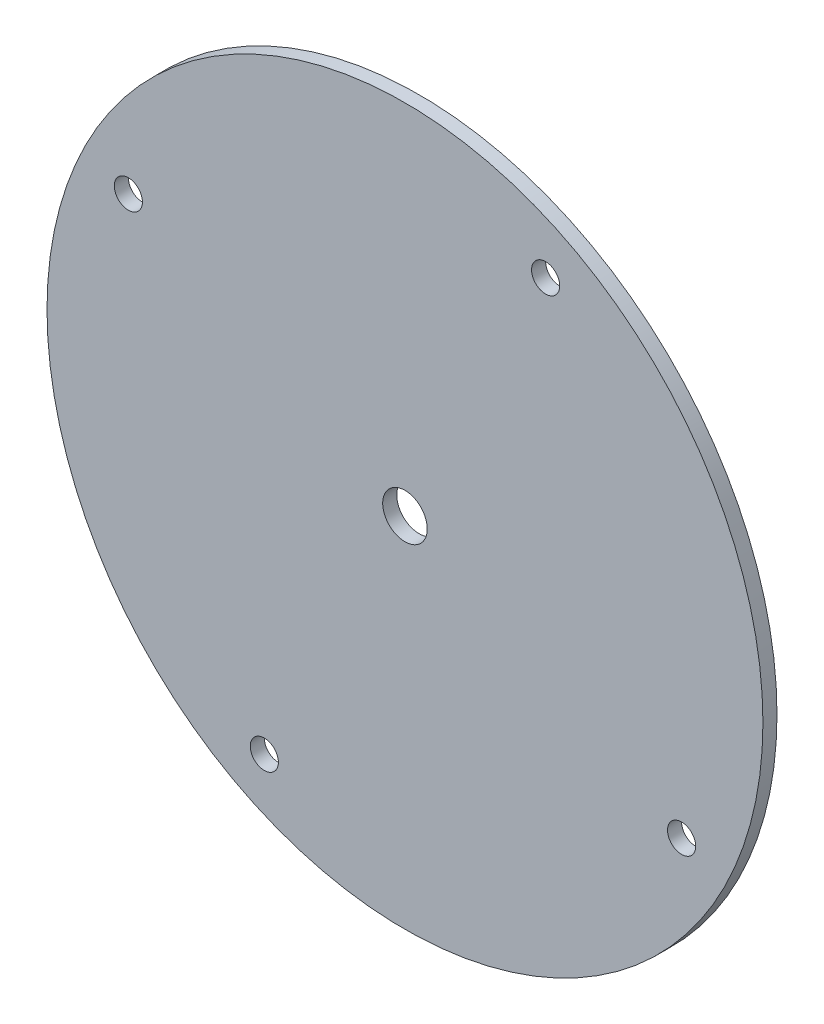
ISO-10303-21;
HEADER;
FILE_DESCRIPTION(('STEP AP214'),'2;1');
FILE_NAME('part.step','',(''),(''),'','','');
FILE_SCHEMA(('AUTOMOTIVE_DESIGN { 1 0 10303 214 1 1 1 1 }'));
ENDSEC;
DATA;
#1=APPLICATION_CONTEXT('core data for automotive mechanical design processes');
#2=APPLICATION_PROTOCOL_DEFINITION('international standard','automotive_design',2000,#1);
#3=PRODUCT_CONTEXT('',#1,'mechanical');
#4=PRODUCT('Part','Part','',(#3));
#5=PRODUCT_RELATED_PRODUCT_CATEGORY('part','',(#4));
#6=PRODUCT_DEFINITION_FORMATION('','',#4);
#7=PRODUCT_DEFINITION_CONTEXT('part definition',#1,'design');
#8=PRODUCT_DEFINITION('design','',#6,#7);
#9=PRODUCT_DEFINITION_SHAPE('','',#8);
#10=(LENGTH_UNIT() NAMED_UNIT(*) SI_UNIT(.MILLI.,.METRE.));
#11=(NAMED_UNIT(*) PLANE_ANGLE_UNIT() SI_UNIT($,.RADIAN.));
#12=(NAMED_UNIT(*) SI_UNIT($,.STERADIAN.) SOLID_ANGLE_UNIT());
#13=UNCERTAINTY_MEASURE_WITH_UNIT(LENGTH_MEASURE(1.E-05),#10,'distance_accuracy_value','');
#14=(GEOMETRIC_REPRESENTATION_CONTEXT(3) GLOBAL_UNCERTAINTY_ASSIGNED_CONTEXT((#13)) GLOBAL_UNIT_ASSIGNED_CONTEXT((#10,
#11,#12)) REPRESENTATION_CONTEXT('',''));
#15=CARTESIAN_POINT('',(0.,0.,0.));
#16=DIRECTION('',(0.,0.,1.));
#17=DIRECTION('',(1.,0.,0.));
#18=AXIS2_PLACEMENT_3D('',#15,#16,#17);
#19=CARTESIAN_POINT('',(-58.9999999999992,29.9999999999995,3.));
#20=DIRECTION('',(0.,0.,-1.));
#21=DIRECTION('',(-1.,0.,0.));
#22=AXIS2_PLACEMENT_3D('',#19,#20,#21);
#23=CYLINDRICAL_SURFACE('',#22,3.);
#24=CARTESIAN_POINT('',(-58.9999999999992,29.9999999999995,3.));
#25=DIRECTION('',(0.,0.,1.));
#26=DIRECTION('',(1.,0.,0.));
#27=AXIS2_PLACEMENT_3D('',#24,#25,#26);
#28=CIRCLE('',#27,3.);
#29=CARTESIAN_POINT('',(-55.9999999999992,29.9999999999995,3.));
#30=VERTEX_POINT('',#29);
#31=EDGE_CURVE('E45',#30,#30,#28,.T.);
#32=ORIENTED_EDGE('',*,*,#31,.T.);
#33=EDGE_LOOP('',(#32));
#34=FACE_BOUND('',#33,.T.);
#35=CARTESIAN_POINT('',(-58.9999999999992,29.9999999999995,0.));
#36=DIRECTION('',(0.,0.,1.));
#37=DIRECTION('',(1.,0.,0.));
#38=AXIS2_PLACEMENT_3D('',#35,#36,#37);
#39=CIRCLE('',#38,3.);
#40=CARTESIAN_POINT('',(-55.9999999999992,29.9999999999995,0.));
#41=VERTEX_POINT('',#40);
#42=EDGE_CURVE('E63',#41,#41,#39,.T.);
#43=ORIENTED_EDGE('',*,*,#42,.F.);
#44=EDGE_LOOP('',(#43));
#45=FACE_BOUND('',#44,.T.);
#46=ADVANCED_FACE('F37',(#34,#45),#23,.F.);
#47=CARTESIAN_POINT('',(59.,-30.0000000000005,3.));
#48=DIRECTION('',(0.,0.,-1.));
#49=DIRECTION('',(-1.,0.,0.));
#50=AXIS2_PLACEMENT_3D('',#47,#48,#49);
#51=CYLINDRICAL_SURFACE('',#50,3.00000000000001);
#52=CARTESIAN_POINT('',(59.,-30.0000000000005,3.));
#53=DIRECTION('',(0.,0.,1.));
#54=DIRECTION('',(1.,0.,0.));
#55=AXIS2_PLACEMENT_3D('',#52,#53,#54);
#56=CIRCLE('',#55,3.00000000000001);
#57=CARTESIAN_POINT('',(62.,-30.0000000000005,3.));
#58=VERTEX_POINT('',#57);
#59=EDGE_CURVE('E50',#58,#58,#56,.T.);
#60=ORIENTED_EDGE('',*,*,#59,.T.);
#61=EDGE_LOOP('',(#60));
#62=FACE_BOUND('',#61,.T.);
#63=CARTESIAN_POINT('',(59.,-30.0000000000005,0.));
#64=DIRECTION('',(0.,0.,1.));
#65=DIRECTION('',(1.,0.,0.));
#66=AXIS2_PLACEMENT_3D('',#63,#64,#65);
#67=CIRCLE('',#66,3.00000000000001);
#68=CARTESIAN_POINT('',(62.,-30.0000000000005,0.));
#69=VERTEX_POINT('',#68);
#70=EDGE_CURVE('E61',#69,#69,#67,.T.);
#71=ORIENTED_EDGE('',*,*,#70,.F.);
#72=EDGE_LOOP('',(#71));
#73=FACE_BOUND('',#72,.T.);
#74=ADVANCED_FACE('F84',(#62,#73),#51,.F.);
#75=CARTESIAN_POINT('',(-29.9999999999992,-59.,3.));
#76=DIRECTION('',(0.,0.,-1.));
#77=DIRECTION('',(-1.,0.,0.));
#78=AXIS2_PLACEMENT_3D('',#75,#76,#77);
#79=CYLINDRICAL_SURFACE('',#78,3.);
#80=CARTESIAN_POINT('',(-29.9999999999992,-59.,3.));
#81=DIRECTION('',(0.,0.,1.));
#82=DIRECTION('',(1.,0.,0.));
#83=AXIS2_PLACEMENT_3D('',#80,#81,#82);
#84=CIRCLE('',#83,3.);
#85=CARTESIAN_POINT('',(-26.9999999999992,-59.,3.));
#86=VERTEX_POINT('',#85);
#87=EDGE_CURVE('E72',#86,#86,#84,.T.);
#88=ORIENTED_EDGE('',*,*,#87,.T.);
#89=EDGE_LOOP('',(#88));
#90=FACE_BOUND('',#89,.T.);
#91=CARTESIAN_POINT('',(-29.9999999999992,-59.,0.));
#92=DIRECTION('',(0.,0.,1.));
#93=DIRECTION('',(1.,0.,0.));
#94=AXIS2_PLACEMENT_3D('',#91,#92,#93);
#95=CIRCLE('',#94,3.);
#96=CARTESIAN_POINT('',(-26.9999999999992,-59.,0.));
#97=VERTEX_POINT('',#96);
#98=EDGE_CURVE('E57',#97,#97,#95,.T.);
#99=ORIENTED_EDGE('',*,*,#98,.F.);
#100=EDGE_LOOP('',(#99));
#101=FACE_BOUND('',#100,.T.);
#102=ADVANCED_FACE('F103',(#90,#101),#79,.F.);
#103=CARTESIAN_POINT('',(0.,0.,3.));
#104=DIRECTION('',(0.,0.,-1.));
#105=DIRECTION('',(-1.,0.,0.));
#106=AXIS2_PLACEMENT_3D('',#103,#104,#105);
#107=CYLINDRICAL_SURFACE('',#106,76.35);
#108=CARTESIAN_POINT('',(0.,0.,3.));
#109=DIRECTION('',(0.,0.,1.));
#110=DIRECTION('',(1.,0.,0.));
#111=AXIS2_PLACEMENT_3D('',#108,#109,#110);
#112=CIRCLE('',#111,76.35);
#113=CARTESIAN_POINT('',(76.35,0.,3.));
#114=VERTEX_POINT('',#113);
#115=EDGE_CURVE('E68',#114,#114,#112,.T.);
#116=ORIENTED_EDGE('',*,*,#115,.F.);
#117=EDGE_LOOP('',(#116));
#118=FACE_BOUND('',#117,.T.);
#119=CARTESIAN_POINT('',(0.,0.,0.));
#120=DIRECTION('',(0.,0.,1.));
#121=DIRECTION('',(1.,0.,0.));
#122=AXIS2_PLACEMENT_3D('',#119,#120,#121);
#123=CIRCLE('',#122,76.35);
#124=CARTESIAN_POINT('',(76.35,0.,0.));
#125=VERTEX_POINT('',#124);
#126=EDGE_CURVE('E54',#125,#125,#123,.T.);
#127=ORIENTED_EDGE('',*,*,#126,.T.);
#128=EDGE_LOOP('',(#127));
#129=FACE_BOUND('',#128,.T.);
#130=ADVANCED_FACE('F39',(#118,#129),#107,.T.);
#131=CARTESIAN_POINT('',(30.0000000000008,59.,3.));
#132=DIRECTION('',(0.,0.,-1.));
#133=DIRECTION('',(-1.,0.,0.));
#134=AXIS2_PLACEMENT_3D('',#131,#132,#133);
#135=CYLINDRICAL_SURFACE('',#134,3.);
#136=CARTESIAN_POINT('',(30.0000000000008,59.,3.));
#137=DIRECTION('',(0.,0.,1.));
#138=DIRECTION('',(1.,0.,0.));
#139=AXIS2_PLACEMENT_3D('',#136,#137,#138);
#140=CIRCLE('',#139,3.);
#141=CARTESIAN_POINT('',(33.0000000000008,59.,3.));
#142=VERTEX_POINT('',#141);
#143=EDGE_CURVE('E10',#142,#142,#140,.T.);
#144=ORIENTED_EDGE('',*,*,#143,.T.);
#145=EDGE_LOOP('',(#144));
#146=FACE_BOUND('',#145,.T.);
#147=CARTESIAN_POINT('',(30.0000000000008,59.,0.));
#148=DIRECTION('',(0.,0.,1.));
#149=DIRECTION('',(1.,0.,0.));
#150=AXIS2_PLACEMENT_3D('',#147,#148,#149);
#151=CIRCLE('',#150,3.);
#152=CARTESIAN_POINT('',(33.0000000000008,59.,0.));
#153=VERTEX_POINT('',#152);
#154=EDGE_CURVE('E41',#153,#153,#151,.T.);
#155=ORIENTED_EDGE('',*,*,#154,.F.);
#156=EDGE_LOOP('',(#155));
#157=FACE_BOUND('',#156,.T.);
#158=ADVANCED_FACE('F91',(#146,#157),#135,.F.);
#159=CARTESIAN_POINT('',(0.,0.,3.));
#160=DIRECTION('',(0.,0.,1.));
#161=DIRECTION('',(1.,0.,0.));
#162=AXIS2_PLACEMENT_3D('',#159,#160,#161);
#163=PLANE('',#162);
#164=CARTESIAN_POINT('',(0.,0.,3.));
#165=DIRECTION('',(0.,0.,1.));
#166=DIRECTION('',(1.,0.,0.));
#167=AXIS2_PLACEMENT_3D('',#164,#165,#166);
#168=CIRCLE('',#167,4.75);
#169=CARTESIAN_POINT('',(4.75,0.,3.));
#170=VERTEX_POINT('',#169);
#171=EDGE_CURVE('E79',#170,#170,#168,.T.);
#172=ORIENTED_EDGE('',*,*,#171,.F.);
#173=EDGE_LOOP('',(#172));
#174=FACE_BOUND('',#173,.T.);
#175=ORIENTED_EDGE('',*,*,#115,.T.);
#176=EDGE_LOOP('',(#175));
#177=FACE_BOUND('',#176,.T.);
#178=ORIENTED_EDGE('',*,*,#87,.F.);
#179=EDGE_LOOP('',(#178));
#180=FACE_BOUND('',#179,.T.);
#181=ORIENTED_EDGE('',*,*,#59,.F.);
#182=EDGE_LOOP('',(#181));
#183=FACE_BOUND('',#182,.T.);
#184=ORIENTED_EDGE('',*,*,#31,.F.);
#185=EDGE_LOOP('',(#184));
#186=FACE_BOUND('',#185,.T.);
#187=ORIENTED_EDGE('',*,*,#143,.F.);
#188=EDGE_LOOP('',(#187));
#189=FACE_BOUND('',#188,.T.);
#190=ADVANCED_FACE('F87',(#174,#177,#180,#183,#186,#189),#163,.T.);
#191=CARTESIAN_POINT('',(0.,0.,0.));
#192=DIRECTION('',(0.,0.,1.));
#193=DIRECTION('',(1.,0.,0.));
#194=AXIS2_PLACEMENT_3D('',#191,#192,#193);
#195=PLANE('',#194);
#196=CARTESIAN_POINT('',(0.,0.,0.));
#197=DIRECTION('',(0.,0.,1.));
#198=DIRECTION('',(1.,0.,0.));
#199=AXIS2_PLACEMENT_3D('',#196,#197,#198);
#200=CIRCLE('',#199,4.75);
#201=CARTESIAN_POINT('',(4.75,0.,0.));
#202=VERTEX_POINT('',#201);
#203=EDGE_CURVE('E58',#202,#202,#200,.T.);
#204=ORIENTED_EDGE('',*,*,#203,.T.);
#205=EDGE_LOOP('',(#204));
#206=FACE_BOUND('',#205,.T.);
#207=ORIENTED_EDGE('',*,*,#126,.F.);
#208=EDGE_LOOP('',(#207));
#209=FACE_BOUND('',#208,.T.);
#210=ORIENTED_EDGE('',*,*,#98,.T.);
#211=EDGE_LOOP('',(#210));
#212=FACE_BOUND('',#211,.T.);
#213=ORIENTED_EDGE('',*,*,#70,.T.);
#214=EDGE_LOOP('',(#213));
#215=FACE_BOUND('',#214,.T.);
#216=ORIENTED_EDGE('',*,*,#42,.T.);
#217=EDGE_LOOP('',(#216));
#218=FACE_BOUND('',#217,.T.);
#219=ORIENTED_EDGE('',*,*,#154,.T.);
#220=EDGE_LOOP('',(#219));
#221=FACE_BOUND('',#220,.T.);
#222=ADVANCED_FACE('F90',(#206,#209,#212,#215,#218,#221),#195,.F.);
#223=CARTESIAN_POINT('',(0.,0.,0.));
#224=DIRECTION('',(0.,0.,1.));
#225=DIRECTION('',(1.,0.,0.));
#226=AXIS2_PLACEMENT_3D('',#223,#224,#225);
#227=CYLINDRICAL_SURFACE('',#226,4.75);
#228=ORIENTED_EDGE('',*,*,#203,.F.);
#229=EDGE_LOOP('',(#228));
#230=FACE_BOUND('',#229,.T.);
#231=ORIENTED_EDGE('',*,*,#171,.T.);
#232=EDGE_LOOP('',(#231));
#233=FACE_BOUND('',#232,.T.);
#234=ADVANCED_FACE('F119',(#230,#233),#227,.F.);
#235=CLOSED_SHELL('',(#46,#74,#102,#130,#158,#190,#222,#234));
#236=MANIFOLD_SOLID_BREP('B2',#235);
#237=ADVANCED_BREP_SHAPE_REPRESENTATION('',(#18,#236),#14);
#238=SHAPE_DEFINITION_REPRESENTATION(#9,#237);
ENDSEC;
END-ISO-10303-21;
